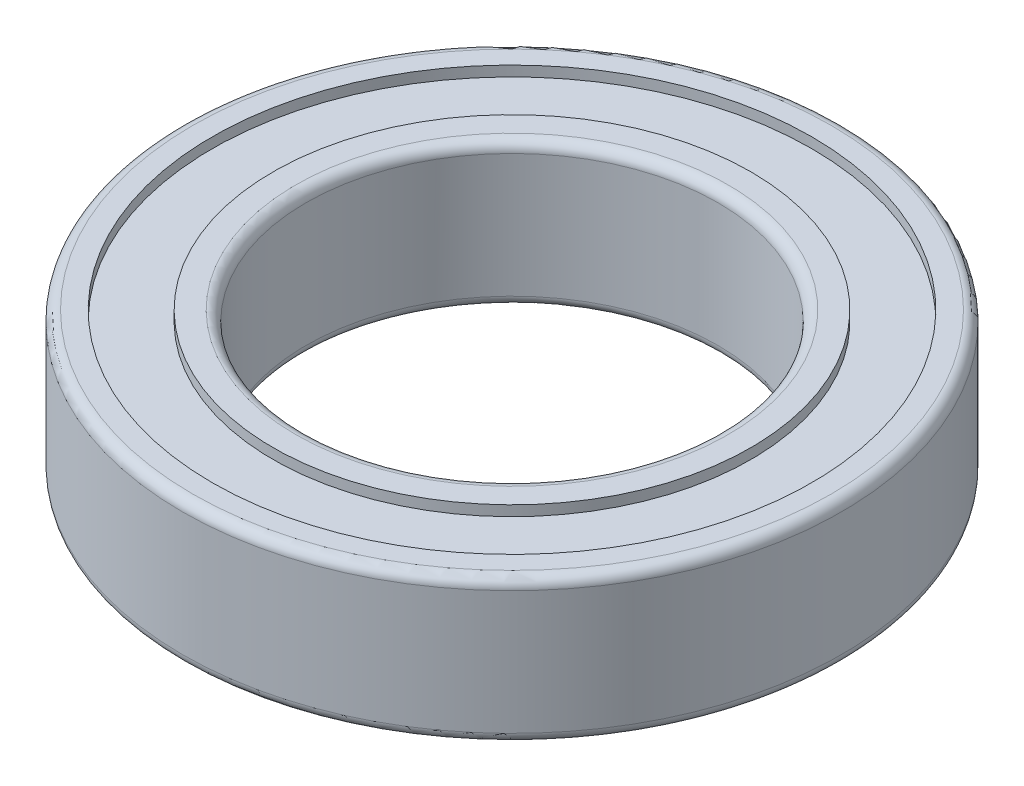
ISO-10303-21;
HEADER;
FILE_DESCRIPTION(('STEP AP214'),'2;1');
FILE_NAME('part.step','',(''),(''),'','','');
FILE_SCHEMA(('AUTOMOTIVE_DESIGN { 1 0 10303 214 1 1 1 1 }'));
ENDSEC;
DATA;
#1=APPLICATION_CONTEXT('core data for automotive mechanical design processes');
#2=APPLICATION_PROTOCOL_DEFINITION('international standard','automotive_design',2000,#1);
#3=PRODUCT_CONTEXT('',#1,'mechanical');
#4=PRODUCT('Part','Part','',(#3));
#5=PRODUCT_RELATED_PRODUCT_CATEGORY('part','',(#4));
#6=PRODUCT_DEFINITION_FORMATION('','',#4);
#7=PRODUCT_DEFINITION_CONTEXT('part definition',#1,'design');
#8=PRODUCT_DEFINITION('design','',#6,#7);
#9=PRODUCT_DEFINITION_SHAPE('','',#8);
#10=(LENGTH_UNIT() NAMED_UNIT(*) SI_UNIT(.MILLI.,.METRE.));
#11=(NAMED_UNIT(*) PLANE_ANGLE_UNIT() SI_UNIT($,.RADIAN.));
#12=(NAMED_UNIT(*) SI_UNIT($,.STERADIAN.) SOLID_ANGLE_UNIT());
#13=UNCERTAINTY_MEASURE_WITH_UNIT(LENGTH_MEASURE(1.E-05),#10,'distance_accuracy_value','');
#14=(GEOMETRIC_REPRESENTATION_CONTEXT(3) GLOBAL_UNCERTAINTY_ASSIGNED_CONTEXT((#13)) GLOBAL_UNIT_ASSIGNED_CONTEXT((#10,
#11,#12)) REPRESENTATION_CONTEXT('',''));
#15=CARTESIAN_POINT('',(0.,0.,0.));
#16=DIRECTION('',(0.,0.,1.));
#17=DIRECTION('',(1.,0.,0.));
#18=AXIS2_PLACEMENT_3D('',#15,#16,#17);
#19=CARTESIAN_POINT('',(0.,0.,0.));
#20=DIRECTION('',(0.,-1.,0.));
#21=DIRECTION('',(0.,0.,-1.));
#22=AXIS2_PLACEMENT_3D('',#19,#20,#21);
#23=CYLINDRICAL_SURFACE('',#22,10.);
#24=CARTESIAN_POINT('',(0.,0.5,0.));
#25=DIRECTION('',(0.,-1.,0.));
#26=DIRECTION('',(0.,0.,-1.));
#27=AXIS2_PLACEMENT_3D('',#24,#25,#26);
#28=CIRCLE('',#27,10.);
#29=CARTESIAN_POINT('',(0.,0.5,-10.));
#30=VERTEX_POINT('',#29);
#31=EDGE_CURVE('E55',#30,#30,#28,.T.);
#32=ORIENTED_EDGE('',*,*,#31,.T.);
#33=EDGE_LOOP('',(#32));
#34=FACE_BOUND('',#33,.T.);
#35=CARTESIAN_POINT('',(0.,6.5,0.));
#36=DIRECTION('',(0.,1.,0.));
#37=DIRECTION('',(0.,0.,1.));
#38=AXIS2_PLACEMENT_3D('',#35,#36,#37);
#39=CIRCLE('',#38,10.);
#40=CARTESIAN_POINT('',(0.,6.5,10.));
#41=VERTEX_POINT('',#40);
#42=EDGE_CURVE('E57',#41,#41,#39,.T.);
#43=ORIENTED_EDGE('',*,*,#42,.T.);
#44=EDGE_LOOP('',(#43));
#45=FACE_BOUND('',#44,.T.);
#46=ADVANCED_FACE('F41',(#34,#45),#23,.F.);
#47=CARTESIAN_POINT('',(10.,0.,0.));
#48=DIRECTION('',(0.,-1.,0.));
#49=DIRECTION('',(0.,0.,-1.));
#50=AXIS2_PLACEMENT_3D('',#47,#48,#49);
#51=PLANE('',#50);
#52=CARTESIAN_POINT('',(0.,0.,0.));
#53=DIRECTION('',(0.,-1.,0.));
#54=DIRECTION('',(0.,0.,-1.));
#55=AXIS2_PLACEMENT_3D('',#52,#53,#54);
#56=CIRCLE('',#55,10.5);
#57=CARTESIAN_POINT('',(0.,0.,-10.5));
#58=VERTEX_POINT('',#57);
#59=EDGE_CURVE('E48',#58,#58,#56,.F.);
#60=ORIENTED_EDGE('',*,*,#59,.T.);
#61=EDGE_LOOP('',(#60));
#62=FACE_BOUND('',#61,.T.);
#63=CARTESIAN_POINT('',(0.,0.,0.));
#64=DIRECTION('',(0.,-1.,0.));
#65=DIRECTION('',(0.,0.,-1.));
#66=AXIS2_PLACEMENT_3D('',#63,#64,#65);
#67=CIRCLE('',#66,11.6);
#68=CARTESIAN_POINT('',(0.,0.,-11.6));
#69=VERTEX_POINT('',#68);
#70=EDGE_CURVE('E71',#69,#69,#67,.T.);
#71=ORIENTED_EDGE('',*,*,#70,.T.);
#72=EDGE_LOOP('',(#71));
#73=FACE_BOUND('',#72,.T.);
#74=ADVANCED_FACE('F116',(#62,#73),#51,.T.);
#75=CARTESIAN_POINT('',(0.,0.,0.));
#76=DIRECTION('',(0.,-1.,0.));
#77=DIRECTION('',(0.,0.,-1.));
#78=AXIS2_PLACEMENT_3D('',#75,#76,#77);
#79=CYLINDRICAL_SURFACE('',#78,11.6);
#80=CARTESIAN_POINT('',(0.,0.5,0.));
#81=DIRECTION('',(0.,-1.,0.));
#82=DIRECTION('',(0.,0.,-1.));
#83=AXIS2_PLACEMENT_3D('',#80,#81,#82);
#84=CIRCLE('',#83,11.6);
#85=CARTESIAN_POINT('',(0.,0.5,-11.6));
#86=VERTEX_POINT('',#85);
#87=EDGE_CURVE('E76',#86,#86,#84,.T.);
#88=ORIENTED_EDGE('',*,*,#87,.T.);
#89=EDGE_LOOP('',(#88));
#90=FACE_BOUND('',#89,.T.);
#91=ORIENTED_EDGE('',*,*,#70,.F.);
#92=EDGE_LOOP('',(#91));
#93=FACE_BOUND('',#92,.T.);
#94=ADVANCED_FACE('F125',(#90,#93),#79,.T.);
#95=CARTESIAN_POINT('',(11.6,0.5,0.));
#96=DIRECTION('',(0.,-1.,0.));
#97=DIRECTION('',(0.,0.,-1.));
#98=AXIS2_PLACEMENT_3D('',#95,#96,#97);
#99=PLANE('',#98);
#100=CARTESIAN_POINT('',(0.,0.5,0.));
#101=DIRECTION('',(0.,-1.,0.));
#102=DIRECTION('',(0.,0.,-1.));
#103=AXIS2_PLACEMENT_3D('',#100,#101,#102);
#104=CIRCLE('',#103,14.55);
#105=CARTESIAN_POINT('',(0.,0.5,-14.55));
#106=VERTEX_POINT('',#105);
#107=EDGE_CURVE('E78',#106,#106,#104,.T.);
#108=ORIENTED_EDGE('',*,*,#107,.T.);
#109=EDGE_LOOP('',(#108));
#110=FACE_BOUND('',#109,.T.);
#111=ORIENTED_EDGE('',*,*,#87,.F.);
#112=EDGE_LOOP('',(#111));
#113=FACE_BOUND('',#112,.T.);
#114=ADVANCED_FACE('F227',(#110,#113),#99,.T.);
#115=CARTESIAN_POINT('',(0.,0.,0.));
#116=DIRECTION('',(0.,-1.,0.));
#117=DIRECTION('',(0.,0.,-1.));
#118=AXIS2_PLACEMENT_3D('',#115,#116,#117);
#119=CYLINDRICAL_SURFACE('',#118,14.55);
#120=CARTESIAN_POINT('',(0.,0.,0.));
#121=DIRECTION('',(0.,-1.,0.));
#122=DIRECTION('',(0.,0.,-1.));
#123=AXIS2_PLACEMENT_3D('',#120,#121,#122);
#124=CIRCLE('',#123,14.55);
#125=CARTESIAN_POINT('',(0.,0.,-14.55));
#126=VERTEX_POINT('',#125);
#127=EDGE_CURVE('E85',#126,#126,#124,.T.);
#128=ORIENTED_EDGE('',*,*,#127,.T.);
#129=EDGE_LOOP('',(#128));
#130=FACE_BOUND('',#129,.T.);
#131=ORIENTED_EDGE('',*,*,#107,.F.);
#132=EDGE_LOOP('',(#131));
#133=FACE_BOUND('',#132,.T.);
#134=ADVANCED_FACE('F217',(#130,#133),#119,.F.);
#135=CARTESIAN_POINT('',(14.55,0.,0.));
#136=DIRECTION('',(0.,-1.,0.));
#137=DIRECTION('',(0.,0.,-1.));
#138=AXIS2_PLACEMENT_3D('',#135,#136,#137);
#139=PLANE('',#138);
#140=CARTESIAN_POINT('',(0.,0.,0.));
#141=DIRECTION('',(0.,-1.,0.));
#142=DIRECTION('',(0.,0.,-1.));
#143=AXIS2_PLACEMENT_3D('',#140,#141,#142);
#144=CIRCLE('',#143,15.5);
#145=CARTESIAN_POINT('',(0.,0.,-15.5));
#146=VERTEX_POINT('',#145);
#147=EDGE_CURVE('E66',#146,#146,#144,.T.);
#148=ORIENTED_EDGE('',*,*,#147,.T.);
#149=EDGE_LOOP('',(#148));
#150=FACE_BOUND('',#149,.T.);
#151=ORIENTED_EDGE('',*,*,#127,.F.);
#152=EDGE_LOOP('',(#151));
#153=FACE_BOUND('',#152,.T.);
#154=ADVANCED_FACE('F208',(#150,#153),#139,.T.);
#155=CARTESIAN_POINT('',(0.,0.,0.));
#156=DIRECTION('',(0.,-1.,0.));
#157=DIRECTION('',(0.,0.,-1.));
#158=AXIS2_PLACEMENT_3D('',#155,#156,#157);
#159=CYLINDRICAL_SURFACE('',#158,16.);
#160=CARTESIAN_POINT('',(0.,0.5,0.));
#161=DIRECTION('',(0.,-1.,0.));
#162=DIRECTION('',(0.,0.,-1.));
#163=AXIS2_PLACEMENT_3D('',#160,#161,#162);
#164=CIRCLE('',#163,16.);
#165=CARTESIAN_POINT('',(0.,0.5,-16.));
#166=VERTEX_POINT('',#165);
#167=EDGE_CURVE('E63',#166,#166,#164,.F.);
#168=ORIENTED_EDGE('',*,*,#167,.T.);
#169=EDGE_LOOP('',(#168));
#170=FACE_BOUND('',#169,.T.);
#171=CARTESIAN_POINT('',(0.,6.5,0.));
#172=DIRECTION('',(0.,1.,0.));
#173=DIRECTION('',(0.,0.,1.));
#174=AXIS2_PLACEMENT_3D('',#171,#172,#173);
#175=CIRCLE('',#174,16.);
#176=CARTESIAN_POINT('',(0.,6.5,16.));
#177=VERTEX_POINT('',#176);
#178=EDGE_CURVE('E70',#177,#177,#175,.F.);
#179=ORIENTED_EDGE('',*,*,#178,.T.);
#180=EDGE_LOOP('',(#179));
#181=FACE_BOUND('',#180,.T.);
#182=ADVANCED_FACE('F196',(#170,#181),#159,.T.);
#183=CARTESIAN_POINT('',(16.,7.,0.));
#184=DIRECTION('',(0.,1.,0.));
#185=DIRECTION('',(0.,0.,1.));
#186=AXIS2_PLACEMENT_3D('',#183,#184,#185);
#187=PLANE('',#186);
#188=CARTESIAN_POINT('',(0.,7.,0.));
#189=DIRECTION('',(0.,1.,0.));
#190=DIRECTION('',(0.,0.,1.));
#191=AXIS2_PLACEMENT_3D('',#188,#189,#190);
#192=CIRCLE('',#191,15.5);
#193=CARTESIAN_POINT('',(0.,7.,15.5));
#194=VERTEX_POINT('',#193);
#195=EDGE_CURVE('E61',#194,#194,#192,.T.);
#196=ORIENTED_EDGE('',*,*,#195,.T.);
#197=EDGE_LOOP('',(#196));
#198=FACE_BOUND('',#197,.T.);
#199=CARTESIAN_POINT('',(0.,7.,0.));
#200=DIRECTION('',(0.,-1.,0.));
#201=DIRECTION('',(0.,0.,-1.));
#202=AXIS2_PLACEMENT_3D('',#199,#200,#201);
#203=CIRCLE('',#202,14.55);
#204=CARTESIAN_POINT('',(0.,7.,-14.55));
#205=VERTEX_POINT('',#204);
#206=EDGE_CURVE('E81',#205,#205,#203,.T.);
#207=ORIENTED_EDGE('',*,*,#206,.T.);
#208=EDGE_LOOP('',(#207));
#209=FACE_BOUND('',#208,.T.);
#210=ADVANCED_FACE('F189',(#198,#209),#187,.T.);
#211=CARTESIAN_POINT('',(0.,0.,0.));
#212=DIRECTION('',(0.,-1.,0.));
#213=DIRECTION('',(0.,0.,-1.));
#214=AXIS2_PLACEMENT_3D('',#211,#212,#213);
#215=CYLINDRICAL_SURFACE('',#214,14.55);
#216=CARTESIAN_POINT('',(0.,6.5,0.));
#217=DIRECTION('',(0.,-1.,0.));
#218=DIRECTION('',(0.,0.,-1.));
#219=AXIS2_PLACEMENT_3D('',#216,#217,#218);
#220=CIRCLE('',#219,14.55);
#221=CARTESIAN_POINT('',(0.,6.5,-14.55));
#222=VERTEX_POINT('',#221);
#223=EDGE_CURVE('E86',#222,#222,#220,.T.);
#224=ORIENTED_EDGE('',*,*,#223,.T.);
#225=EDGE_LOOP('',(#224));
#226=FACE_BOUND('',#225,.T.);
#227=ORIENTED_EDGE('',*,*,#206,.F.);
#228=EDGE_LOOP('',(#227));
#229=FACE_BOUND('',#228,.T.);
#230=ADVANCED_FACE('F178',(#226,#229),#215,.F.);
#231=CARTESIAN_POINT('',(14.55,6.5,0.));
#232=DIRECTION('',(0.,1.,0.));
#233=DIRECTION('',(0.,0.,1.));
#234=AXIS2_PLACEMENT_3D('',#231,#232,#233);
#235=PLANE('',#234);
#236=CARTESIAN_POINT('',(0.,6.5,0.));
#237=DIRECTION('',(0.,-1.,0.));
#238=DIRECTION('',(0.,0.,-1.));
#239=AXIS2_PLACEMENT_3D('',#236,#237,#238);
#240=CIRCLE('',#239,11.6);
#241=CARTESIAN_POINT('',(0.,6.5,-11.6));
#242=VERTEX_POINT('',#241);
#243=EDGE_CURVE('E93',#242,#242,#240,.T.);
#244=ORIENTED_EDGE('',*,*,#243,.T.);
#245=EDGE_LOOP('',(#244));
#246=FACE_BOUND('',#245,.T.);
#247=ORIENTED_EDGE('',*,*,#223,.F.);
#248=EDGE_LOOP('',(#247));
#249=FACE_BOUND('',#248,.T.);
#250=ADVANCED_FACE('F114',(#246,#249),#235,.T.);
#251=CARTESIAN_POINT('',(0.,0.,0.));
#252=DIRECTION('',(0.,-1.,0.));
#253=DIRECTION('',(0.,0.,-1.));
#254=AXIS2_PLACEMENT_3D('',#251,#252,#253);
#255=CYLINDRICAL_SURFACE('',#254,11.6);
#256=CARTESIAN_POINT('',(0.,7.,0.));
#257=DIRECTION('',(0.,-1.,0.));
#258=DIRECTION('',(0.,0.,-1.));
#259=AXIS2_PLACEMENT_3D('',#256,#257,#258);
#260=CIRCLE('',#259,11.6);
#261=CARTESIAN_POINT('',(0.,7.,-11.6));
#262=VERTEX_POINT('',#261);
#263=EDGE_CURVE('E94',#262,#262,#260,.T.);
#264=ORIENTED_EDGE('',*,*,#263,.T.);
#265=EDGE_LOOP('',(#264));
#266=FACE_BOUND('',#265,.T.);
#267=ORIENTED_EDGE('',*,*,#243,.F.);
#268=EDGE_LOOP('',(#267));
#269=FACE_BOUND('',#268,.T.);
#270=ADVANCED_FACE('F98',(#266,#269),#255,.T.);
#271=CARTESIAN_POINT('',(11.6,7.,0.));
#272=DIRECTION('',(0.,1.,0.));
#273=DIRECTION('',(0.,0.,1.));
#274=AXIS2_PLACEMENT_3D('',#271,#272,#273);
#275=PLANE('',#274);
#276=CARTESIAN_POINT('',(0.,7.,0.));
#277=DIRECTION('',(0.,1.,0.));
#278=DIRECTION('',(0.,0.,1.));
#279=AXIS2_PLACEMENT_3D('',#276,#277,#278);
#280=CIRCLE('',#279,10.5);
#281=CARTESIAN_POINT('',(0.,7.,10.5));
#282=VERTEX_POINT('',#281);
#283=EDGE_CURVE('E10',#282,#282,#280,.F.);
#284=ORIENTED_EDGE('',*,*,#283,.T.);
#285=EDGE_LOOP('',(#284));
#286=FACE_BOUND('',#285,.T.);
#287=ORIENTED_EDGE('',*,*,#263,.F.);
#288=EDGE_LOOP('',(#287));
#289=FACE_BOUND('',#288,.T.);
#290=ADVANCED_FACE('F101',(#286,#289),#275,.T.);
#291=CARTESIAN_POINT('',(0.,0.5,0.));
#292=DIRECTION('',(0.,-1.,0.));
#293=DIRECTION('',(0.,0.,-1.));
#294=AXIS2_PLACEMENT_3D('',#291,#292,#293);
#295=TOROIDAL_SURFACE('',#294,15.5,0.5);
#296=ORIENTED_EDGE('',*,*,#167,.F.);
#297=EDGE_LOOP('',(#296));
#298=FACE_BOUND('',#297,.T.);
#299=ORIENTED_EDGE('',*,*,#147,.F.);
#300=EDGE_LOOP('',(#299));
#301=FACE_BOUND('',#300,.T.);
#302=ADVANCED_FACE('F103',(#298,#301),#295,.T.);
#303=CARTESIAN_POINT('',(0.,6.5,0.));
#304=DIRECTION('',(0.,1.,0.));
#305=DIRECTION('',(0.,0.,1.));
#306=AXIS2_PLACEMENT_3D('',#303,#304,#305);
#307=TOROIDAL_SURFACE('',#306,15.5,0.5);
#308=ORIENTED_EDGE('',*,*,#195,.F.);
#309=EDGE_LOOP('',(#308));
#310=FACE_BOUND('',#309,.T.);
#311=ORIENTED_EDGE('',*,*,#178,.F.);
#312=EDGE_LOOP('',(#311));
#313=FACE_BOUND('',#312,.T.);
#314=ADVANCED_FACE('F108',(#310,#313),#307,.T.);
#315=CARTESIAN_POINT('',(0.,0.5,0.));
#316=DIRECTION('',(0.,-1.,0.));
#317=DIRECTION('',(0.,0.,-1.));
#318=AXIS2_PLACEMENT_3D('',#315,#316,#317);
#319=TOROIDAL_SURFACE('',#318,10.5,0.5);
#320=ORIENTED_EDGE('',*,*,#59,.F.);
#321=EDGE_LOOP('',(#320));
#322=FACE_BOUND('',#321,.T.);
#323=ORIENTED_EDGE('',*,*,#31,.F.);
#324=EDGE_LOOP('',(#323));
#325=FACE_BOUND('',#324,.T.);
#326=ADVANCED_FACE('F126',(#322,#325),#319,.T.);
#327=CARTESIAN_POINT('',(0.,6.5,0.));
#328=DIRECTION('',(0.,1.,0.));
#329=DIRECTION('',(0.,0.,1.));
#330=AXIS2_PLACEMENT_3D('',#327,#328,#329);
#331=TOROIDAL_SURFACE('',#330,10.5,0.5);
#332=ORIENTED_EDGE('',*,*,#42,.F.);
#333=EDGE_LOOP('',(#332));
#334=FACE_BOUND('',#333,.T.);
#335=ORIENTED_EDGE('',*,*,#283,.F.);
#336=EDGE_LOOP('',(#335));
#337=FACE_BOUND('',#336,.T.);
#338=ADVANCED_FACE('F43',(#334,#337),#331,.T.);
#339=CLOSED_SHELL('',(#46,#74,#94,#114,#134,#154,#182,#210,#230,#250,#270,#290,#302,#314,#326,#338));
#340=MANIFOLD_SOLID_BREP('B2',#339);
#341=ADVANCED_BREP_SHAPE_REPRESENTATION('',(#18,#340),#14);
#342=SHAPE_DEFINITION_REPRESENTATION(#9,#341);
ENDSEC;
END-ISO-10303-21;
